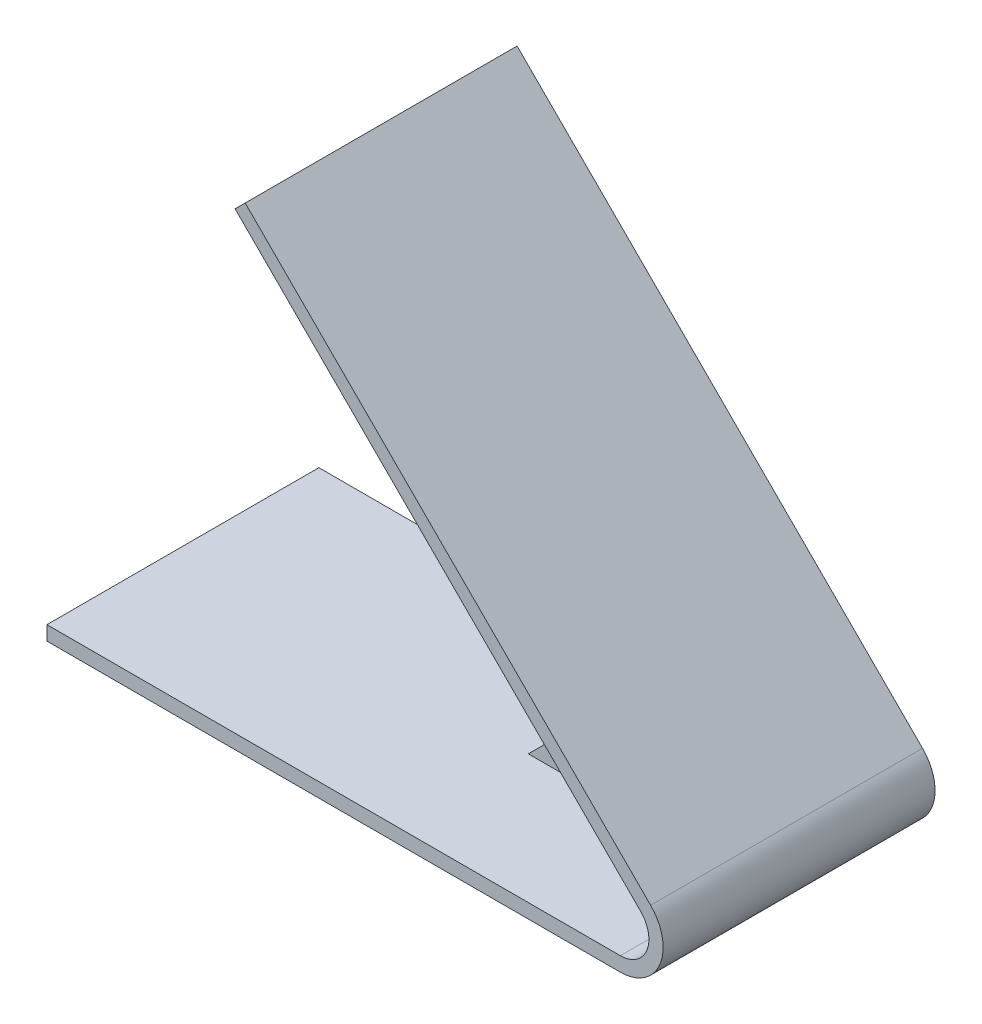
ISO-10303-21;
HEADER;
FILE_DESCRIPTION(('STEP AP214'),'2;1');
FILE_NAME('part.step','',(''),(''),'','','');
FILE_SCHEMA(('AUTOMOTIVE_DESIGN { 1 0 10303 214 1 1 1 1 }'));
ENDSEC;
DATA;
#1=APPLICATION_CONTEXT('core data for automotive mechanical design processes');
#2=APPLICATION_PROTOCOL_DEFINITION('international standard','automotive_design',2000,#1);
#3=PRODUCT_CONTEXT('',#1,'mechanical');
#4=PRODUCT('Part','Part','',(#3));
#5=PRODUCT_RELATED_PRODUCT_CATEGORY('part','',(#4));
#6=PRODUCT_DEFINITION_FORMATION('','',#4);
#7=PRODUCT_DEFINITION_CONTEXT('part definition',#1,'design');
#8=PRODUCT_DEFINITION('design','',#6,#7);
#9=PRODUCT_DEFINITION_SHAPE('','',#8);
#10=(LENGTH_UNIT() NAMED_UNIT(*) SI_UNIT(.MILLI.,.METRE.));
#11=(NAMED_UNIT(*) PLANE_ANGLE_UNIT() SI_UNIT($,.RADIAN.));
#12=(NAMED_UNIT(*) SI_UNIT($,.STERADIAN.) SOLID_ANGLE_UNIT());
#13=UNCERTAINTY_MEASURE_WITH_UNIT(LENGTH_MEASURE(1.E-05),#10,'distance_accuracy_value','');
#14=(GEOMETRIC_REPRESENTATION_CONTEXT(3) GLOBAL_UNCERTAINTY_ASSIGNED_CONTEXT((#13)) GLOBAL_UNIT_ASSIGNED_CONTEXT((#10,
#11,#12)) REPRESENTATION_CONTEXT('',''));
#15=CARTESIAN_POINT('',(0.,0.,0.));
#16=DIRECTION('',(0.,0.,1.));
#17=DIRECTION('',(1.,0.,0.));
#18=AXIS2_PLACEMENT_3D('',#15,#16,#17);
#19=CARTESIAN_POINT('',(-6.82842712474628,6.82842712474621,38.1));
#20=DIRECTION('',(0.707106781186544,0.707106781186551,0.));
#21=DIRECTION('',(-0.707106781186551,0.707106781186544,0.));
#22=AXIS2_PLACEMENT_3D('',#19,#20,#21);
#23=PLANE('',#22);
#24=DIRECTION('',(-0.707106781186564,0.707106781186531,0.));
#25=VECTOR('',#24,1.);
#26=CARTESIAN_POINT('',(-20.2988113063503,20.2988113063496,20.05));
#27=LINE('',#26,#25);
#28=CARTESIAN_POINT('',(-6.82842712474628,6.82842712474621,20.05));
#29=VERTEX_POINT('',#28);
#30=CARTESIAN_POINT('',(-20.2988113063503,20.2988113063496,20.05));
#31=VERTEX_POINT('',#30);
#32=EDGE_CURVE('E138',#29,#31,#27,.T.);
#33=ORIENTED_EDGE('',*,*,#32,.F.);
#34=DIRECTION('',(0.,0.,-1.));
#35=VECTOR('',#34,1.);
#36=CARTESIAN_POINT('',(-6.82842712474628,6.82842712474621,38.1));
#37=LINE('',#36,#35);
#38=CARTESIAN_POINT('',(-6.82842712474628,6.82842712474621,38.1));
#39=VERTEX_POINT('',#38);
#40=EDGE_CURVE('E51',#39,#29,#37,.T.);
#41=ORIENTED_EDGE('',*,*,#40,.F.);
#42=DIRECTION('',(0.707106781186551,-0.707106781186544,0.));
#43=VECTOR('',#42,1.);
#44=CARTESIAN_POINT('',(-6.82842712474628,6.82842712474621,38.1));
#45=LINE('',#44,#43);
#46=CARTESIAN_POINT('',(-63.6396103067896,63.6396103067889,38.1));
#47=VERTEX_POINT('',#46);
#48=EDGE_CURVE('E166',#47,#39,#45,.T.);
#49=ORIENTED_EDGE('',*,*,#48,.F.);
#50=DIRECTION('',(0.,0.,-1.));
#51=VECTOR('',#50,1.);
#52=CARTESIAN_POINT('',(-63.6396103067896,63.6396103067889,38.1));
#53=LINE('',#52,#51);
#54=CARTESIAN_POINT('',(-63.6396103067896,63.6396103067889,0.));
#55=VERTEX_POINT('',#54);
#56=EDGE_CURVE('E13',#47,#55,#53,.T.);
#57=ORIENTED_EDGE('',*,*,#56,.T.);
#58=DIRECTION('',(0.707106781186551,-0.707106781186544,0.));
#59=VECTOR('',#58,1.);
#60=CARTESIAN_POINT('',(-6.82842712474628,6.82842712474621,0.));
#61=LINE('',#60,#59);
#62=CARTESIAN_POINT('',(-6.82842712474628,6.82842712474621,0.));
#63=VERTEX_POINT('',#62);
#64=EDGE_CURVE('E157',#55,#63,#61,.T.);
#65=ORIENTED_EDGE('',*,*,#64,.T.);
#66=CARTESIAN_POINT('',(-6.82842712474628,6.82842712474621,18.05));
#67=VERTEX_POINT('',#66);
#68=EDGE_CURVE('E211',#67,#63,#37,.T.);
#69=ORIENTED_EDGE('',*,*,#68,.F.);
#70=DIRECTION('',(-0.707106781186564,0.707106781186531,0.));
#71=VECTOR('',#70,1.);
#72=CARTESIAN_POINT('',(-20.2988113063503,20.2988113063496,18.05));
#73=LINE('',#72,#71);
#74=CARTESIAN_POINT('',(-20.2988113063503,20.2988113063496,18.05));
#75=VERTEX_POINT('',#74);
#76=EDGE_CURVE('E58',#67,#75,#73,.T.);
#77=ORIENTED_EDGE('',*,*,#76,.T.);
#78=DIRECTION('',(0.,0.,-1.));
#79=VECTOR('',#78,1.);
#80=CARTESIAN_POINT('',(-20.2988113063503,20.2988113063496,20.05));
#81=LINE('',#80,#79);
#82=EDGE_CURVE('E159',#31,#75,#81,.T.);
#83=ORIENTED_EDGE('',*,*,#82,.F.);
#84=EDGE_LOOP('',(#33,#41,#49,#57,#65,#69,#77,#83));
#85=FACE_BOUND('',#84,.T.);
#86=ADVANCED_FACE('F43',(#85),#23,.F.);
#87=CARTESIAN_POINT('',(-9.65685424949246,0.,38.1));
#88=DIRECTION('',(0.,-1.,0.));
#89=DIRECTION('',(1.,0.,0.));
#90=AXIS2_PLACEMENT_3D('',#87,#88,#89);
#91=PLANE('',#90);
#92=DIRECTION('',(-1.,0.,0.));
#93=VECTOR('',#92,1.);
#94=CARTESIAN_POINT('',(-9.65685424949246,0.,0.));
#95=LINE('',#94,#93);
#96=CARTESIAN_POINT('',(-9.65685424949245,0.,0.));
#97=VERTEX_POINT('',#96);
#98=CARTESIAN_POINT('',(-90.,0.,0.));
#99=VERTEX_POINT('',#98);
#100=EDGE_CURVE('E186',#97,#99,#95,.T.);
#101=ORIENTED_EDGE('',*,*,#100,.T.);
#102=DIRECTION('',(0.,0.,-1.));
#103=VECTOR('',#102,1.);
#104=CARTESIAN_POINT('',(-90.,0.,38.1));
#105=LINE('',#104,#103);
#106=CARTESIAN_POINT('',(-90.,0.,38.1));
#107=VERTEX_POINT('',#106);
#108=EDGE_CURVE('E206',#107,#99,#105,.T.);
#109=ORIENTED_EDGE('',*,*,#108,.F.);
#110=DIRECTION('',(-1.,0.,0.));
#111=VECTOR('',#110,1.);
#112=CARTESIAN_POINT('',(-9.65685424949246,0.,38.1));
#113=LINE('',#112,#111);
#114=CARTESIAN_POINT('',(-9.65685424949245,0.,38.1));
#115=VERTEX_POINT('',#114);
#116=EDGE_CURVE('E171',#115,#107,#113,.T.);
#117=ORIENTED_EDGE('',*,*,#116,.F.);
#118=DIRECTION('',(0.,0.,-1.));
#119=VECTOR('',#118,1.);
#120=CARTESIAN_POINT('',(-9.65685424949245,0.,38.1));
#121=LINE('',#120,#119);
#122=EDGE_CURVE('E209',#115,#97,#121,.T.);
#123=ORIENTED_EDGE('',*,*,#122,.T.);
#124=EDGE_LOOP('',(#101,#109,#117,#123));
#125=FACE_BOUND('',#124,.T.);
#126=DIRECTION('',(1.,0.,0.));
#127=VECTOR('',#126,1.);
#128=CARTESIAN_POINT('',(-13.6568542494925,0.,20.05));
#129=LINE('',#128,#127);
#130=CARTESIAN_POINT('',(-40.5976226127,0.,20.05));
#131=VERTEX_POINT('',#130);
#132=CARTESIAN_POINT('',(-13.6568542494925,0.,20.05));
#133=VERTEX_POINT('',#132);
#134=EDGE_CURVE('E139',#131,#133,#129,.T.);
#135=ORIENTED_EDGE('',*,*,#134,.F.);
#136=DIRECTION('',(0.,0.,-1.));
#137=VECTOR('',#136,1.);
#138=CARTESIAN_POINT('',(-40.5976226127,0.,20.05));
#139=LINE('',#138,#137);
#140=CARTESIAN_POINT('',(-40.5976226127,0.,18.05));
#141=VERTEX_POINT('',#140);
#142=EDGE_CURVE('E242',#131,#141,#139,.T.);
#143=ORIENTED_EDGE('',*,*,#142,.T.);
#144=DIRECTION('',(1.,0.,0.));
#145=VECTOR('',#144,1.);
#146=CARTESIAN_POINT('',(-13.6568542494925,0.,18.05));
#147=LINE('',#146,#145);
#148=CARTESIAN_POINT('',(-13.6568542494925,0.,18.05));
#149=VERTEX_POINT('',#148);
#150=EDGE_CURVE('E153',#141,#149,#147,.T.);
#151=ORIENTED_EDGE('',*,*,#150,.T.);
#152=DIRECTION('',(0.,0.,-1.));
#153=VECTOR('',#152,1.);
#154=CARTESIAN_POINT('',(-13.6568542494925,0.,20.05));
#155=LINE('',#154,#153);
#156=EDGE_CURVE('E65',#133,#149,#155,.T.);
#157=ORIENTED_EDGE('',*,*,#156,.F.);
#158=EDGE_LOOP('',(#135,#143,#151,#157));
#159=FACE_BOUND('',#158,.T.);
#160=ADVANCED_FACE('F151',(#125,#159),#91,.F.);
#161=CARTESIAN_POINT('',(-62.2253967444165,65.053823869162,38.1));
#162=DIRECTION('',(0.707106781186554,-0.707106781186541,0.));
#163=DIRECTION('',(0.707106781186541,0.707106781186554,0.));
#164=AXIS2_PLACEMENT_3D('',#161,#162,#163);
#165=PLANE('',#164);
#166=DIRECTION('',(-0.707106781186541,-0.707106781186554,0.));
#167=VECTOR('',#166,1.);
#168=CARTESIAN_POINT('',(-62.2253967444165,65.053823869162,0.));
#169=LINE('',#168,#167);
#170=CARTESIAN_POINT('',(-62.2253967444165,65.053823869162,0.));
#171=VERTEX_POINT('',#170);
#172=EDGE_CURVE('E154',#171,#55,#169,.T.);
#173=ORIENTED_EDGE('',*,*,#172,.T.);
#174=ORIENTED_EDGE('',*,*,#56,.F.);
#175=DIRECTION('',(-0.707106781186541,-0.707106781186554,0.));
#176=VECTOR('',#175,1.);
#177=CARTESIAN_POINT('',(-62.2253967444165,65.053823869162,38.1));
#178=LINE('',#177,#176);
#179=CARTESIAN_POINT('',(-62.2253967444165,65.053823869162,38.1));
#180=VERTEX_POINT('',#179);
#181=EDGE_CURVE('E163',#180,#47,#178,.T.);
#182=ORIENTED_EDGE('',*,*,#181,.F.);
#183=DIRECTION('',(0.,0.,-1.));
#184=VECTOR('',#183,1.);
#185=CARTESIAN_POINT('',(-62.2253967444165,65.053823869162,38.1));
#186=LINE('',#185,#184);
#187=EDGE_CURVE('E180',#180,#171,#186,.T.);
#188=ORIENTED_EDGE('',*,*,#187,.T.);
#189=EDGE_LOOP('',(#173,#174,#182,#188));
#190=FACE_BOUND('',#189,.T.);
#191=ADVANCED_FACE('F45',(#190),#165,.F.);
#192=CARTESIAN_POINT('',(-9.65685424949245,4.,38.1));
#193=DIRECTION('',(0.,0.,-1.));
#194=DIRECTION('',(-1.,0.,0.));
#195=AXIS2_PLACEMENT_3D('',#192,#193,#194);
#196=CYLINDRICAL_SURFACE('',#195,4.);
#197=CARTESIAN_POINT('',(-9.65685424949245,4.,0.));
#198=DIRECTION('',(0.,0.,-1.));
#199=DIRECTION('',(-1.,0.,0.));
#200=AXIS2_PLACEMENT_3D('',#197,#198,#199);
#201=CIRCLE('',#200,4.);
#202=EDGE_CURVE('E184',#63,#97,#201,.T.);
#203=ORIENTED_EDGE('',*,*,#202,.T.);
#204=ORIENTED_EDGE('',*,*,#122,.F.);
#205=CARTESIAN_POINT('',(-9.65685424949245,4.,38.1));
#206=DIRECTION('',(0.,0.,-1.));
#207=DIRECTION('',(-1.,0.,0.));
#208=AXIS2_PLACEMENT_3D('',#205,#206,#207);
#209=CIRCLE('',#208,4.);
#210=EDGE_CURVE('E169',#39,#115,#209,.T.);
#211=ORIENTED_EDGE('',*,*,#210,.F.);
#212=ORIENTED_EDGE('',*,*,#40,.T.);
#213=DIRECTION('',(0.,0.,-1.));
#214=VECTOR('',#213,1.);
#215=CARTESIAN_POINT('',(-6.82842712474628,6.82842712474621,20.05));
#216=LINE('',#215,#214);
#217=EDGE_CURVE('E135',#29,#67,#216,.T.);
#218=ORIENTED_EDGE('',*,*,#217,.T.);
#219=ORIENTED_EDGE('',*,*,#68,.T.);
#220=EDGE_LOOP('',(#203,#204,#211,#212,#218,#219));
#221=FACE_BOUND('',#220,.T.);
#222=ADVANCED_FACE('F217',(#221),#196,.F.);
#223=CARTESIAN_POINT('',(-90.,-2.,38.1));
#224=DIRECTION('',(1.,0.,0.));
#225=DIRECTION('',(0.,0.,-1.));
#226=AXIS2_PLACEMENT_3D('',#223,#224,#225);
#227=PLANE('',#226);
#228=DIRECTION('',(0.,-1.,0.));
#229=VECTOR('',#228,1.);
#230=CARTESIAN_POINT('',(-90.,-2.,0.));
#231=LINE('',#230,#229);
#232=CARTESIAN_POINT('',(-90.,-2.,0.));
#233=VERTEX_POINT('',#232);
#234=EDGE_CURVE('E188',#99,#233,#231,.T.);
#235=ORIENTED_EDGE('',*,*,#234,.T.);
#236=DIRECTION('',(0.,0.,-1.));
#237=VECTOR('',#236,1.);
#238=CARTESIAN_POINT('',(-90.,-2.,38.1));
#239=LINE('',#238,#237);
#240=CARTESIAN_POINT('',(-90.,-2.,38.1));
#241=VERTEX_POINT('',#240);
#242=EDGE_CURVE('E203',#241,#233,#239,.T.);
#243=ORIENTED_EDGE('',*,*,#242,.F.);
#244=DIRECTION('',(0.,-1.,0.));
#245=VECTOR('',#244,1.);
#246=CARTESIAN_POINT('',(-90.,-2.,38.1));
#247=LINE('',#246,#245);
#248=EDGE_CURVE('E173',#107,#241,#247,.T.);
#249=ORIENTED_EDGE('',*,*,#248,.F.);
#250=ORIENTED_EDGE('',*,*,#108,.T.);
#251=EDGE_LOOP('',(#235,#243,#249,#250));
#252=FACE_BOUND('',#251,.T.);
#253=ADVANCED_FACE('F233',(#252),#227,.F.);
#254=CARTESIAN_POINT('',(-9.65685424949246,-2.,38.1));
#255=DIRECTION('',(0.,1.,0.));
#256=DIRECTION('',(0.,0.,1.));
#257=AXIS2_PLACEMENT_3D('',#254,#255,#256);
#258=PLANE('',#257);
#259=DIRECTION('',(1.,0.,0.));
#260=VECTOR('',#259,1.);
#261=CARTESIAN_POINT('',(-9.65685424949246,-2.,0.));
#262=LINE('',#261,#260);
#263=CARTESIAN_POINT('',(-9.65685424949246,-2.,0.));
#264=VERTEX_POINT('',#263);
#265=EDGE_CURVE('E190',#233,#264,#262,.T.);
#266=ORIENTED_EDGE('',*,*,#265,.T.);
#267=DIRECTION('',(0.,0.,-1.));
#268=VECTOR('',#267,1.);
#269=CARTESIAN_POINT('',(-9.65685424949246,-2.,38.1));
#270=LINE('',#269,#268);
#271=CARTESIAN_POINT('',(-9.65685424949246,-2.,38.1));
#272=VERTEX_POINT('',#271);
#273=EDGE_CURVE('E200',#272,#264,#270,.T.);
#274=ORIENTED_EDGE('',*,*,#273,.F.);
#275=DIRECTION('',(1.,0.,0.));
#276=VECTOR('',#275,1.);
#277=CARTESIAN_POINT('',(-9.65685424949246,-2.,38.1));
#278=LINE('',#277,#276);
#279=EDGE_CURVE('E175',#241,#272,#278,.T.);
#280=ORIENTED_EDGE('',*,*,#279,.F.);
#281=ORIENTED_EDGE('',*,*,#242,.T.);
#282=EDGE_LOOP('',(#266,#274,#280,#281));
#283=FACE_BOUND('',#282,.T.);
#284=ADVANCED_FACE('F270',(#283),#258,.F.);
#285=CARTESIAN_POINT('',(-9.65685424949246,4.,38.1));
#286=DIRECTION('',(0.,0.,-1.));
#287=DIRECTION('',(-1.,0.,0.));
#288=AXIS2_PLACEMENT_3D('',#285,#286,#287);
#289=CYLINDRICAL_SURFACE('',#288,6.);
#290=CARTESIAN_POINT('',(-9.65685424949246,4.,0.));
#291=DIRECTION('',(0.,0.,1.));
#292=DIRECTION('',(-1.,0.,0.));
#293=AXIS2_PLACEMENT_3D('',#290,#291,#292);
#294=CIRCLE('',#293,6.);
#295=CARTESIAN_POINT('',(-5.41421356237319,8.24264068711931,0.));
#296=VERTEX_POINT('',#295);
#297=EDGE_CURVE('E192',#264,#296,#294,.T.);
#298=ORIENTED_EDGE('',*,*,#297,.T.);
#299=DIRECTION('',(0.,0.,-1.));
#300=VECTOR('',#299,1.);
#301=CARTESIAN_POINT('',(-5.41421356237319,8.24264068711931,38.1));
#302=LINE('',#301,#300);
#303=CARTESIAN_POINT('',(-5.41421356237319,8.24264068711931,38.1));
#304=VERTEX_POINT('',#303);
#305=EDGE_CURVE('E197',#304,#296,#302,.T.);
#306=ORIENTED_EDGE('',*,*,#305,.F.);
#307=CARTESIAN_POINT('',(-9.65685424949246,4.,38.1));
#308=DIRECTION('',(0.,0.,1.));
#309=DIRECTION('',(-1.,0.,0.));
#310=AXIS2_PLACEMENT_3D('',#307,#308,#309);
#311=CIRCLE('',#310,6.);
#312=EDGE_CURVE('E177',#272,#304,#311,.T.);
#313=ORIENTED_EDGE('',*,*,#312,.F.);
#314=ORIENTED_EDGE('',*,*,#273,.T.);
#315=EDGE_LOOP('',(#298,#306,#313,#314));
#316=FACE_BOUND('',#315,.T.);
#317=ADVANCED_FACE('F273',(#316),#289,.T.);
#318=CARTESIAN_POINT('',(-5.41421356237319,8.24264068711931,38.1));
#319=DIRECTION('',(-0.707106781186544,-0.707106781186551,0.));
#320=DIRECTION('',(0.707106781186551,-0.707106781186544,0.));
#321=AXIS2_PLACEMENT_3D('',#318,#319,#320);
#322=PLANE('',#321);
#323=DIRECTION('',(-0.707106781186551,0.707106781186544,0.));
#324=VECTOR('',#323,1.);
#325=CARTESIAN_POINT('',(-5.41421356237319,8.24264068711931,0.));
#326=LINE('',#325,#324);
#327=EDGE_CURVE('E167',#296,#171,#326,.T.);
#328=ORIENTED_EDGE('',*,*,#327,.T.);
#329=ORIENTED_EDGE('',*,*,#187,.F.);
#330=DIRECTION('',(-0.707106781186551,0.707106781186544,0.));
#331=VECTOR('',#330,1.);
#332=CARTESIAN_POINT('',(-5.41421356237319,8.24264068711931,38.1));
#333=LINE('',#332,#331);
#334=EDGE_CURVE('E179',#304,#180,#333,.T.);
#335=ORIENTED_EDGE('',*,*,#334,.F.);
#336=ORIENTED_EDGE('',*,*,#305,.T.);
#337=EDGE_LOOP('',(#328,#329,#335,#336));
#338=FACE_BOUND('',#337,.T.);
#339=ADVANCED_FACE('F277',(#338),#322,.F.);
#340=CARTESIAN_POINT('',(-9.65685424949245,4.,38.1));
#341=DIRECTION('',(0.,0.,-1.));
#342=DIRECTION('',(-1.,0.,0.));
#343=AXIS2_PLACEMENT_3D('',#340,#341,#342);
#344=PLANE('',#343);
#345=ORIENTED_EDGE('',*,*,#181,.T.);
#346=ORIENTED_EDGE('',*,*,#48,.T.);
#347=ORIENTED_EDGE('',*,*,#210,.T.);
#348=ORIENTED_EDGE('',*,*,#116,.T.);
#349=ORIENTED_EDGE('',*,*,#248,.T.);
#350=ORIENTED_EDGE('',*,*,#279,.T.);
#351=ORIENTED_EDGE('',*,*,#312,.T.);
#352=ORIENTED_EDGE('',*,*,#334,.T.);
#353=EDGE_LOOP('',(#345,#346,#347,#348,#349,#350,#351,#352));
#354=FACE_BOUND('',#353,.T.);
#355=ADVANCED_FACE('F237',(#354),#344,.F.);
#356=CARTESIAN_POINT('',(-9.65685424949245,4.,0.));
#357=DIRECTION('',(0.,0.,-1.));
#358=DIRECTION('',(-1.,0.,0.));
#359=AXIS2_PLACEMENT_3D('',#356,#357,#358);
#360=PLANE('',#359);
#361=ORIENTED_EDGE('',*,*,#172,.F.);
#362=ORIENTED_EDGE('',*,*,#327,.F.);
#363=ORIENTED_EDGE('',*,*,#297,.F.);
#364=ORIENTED_EDGE('',*,*,#265,.F.);
#365=ORIENTED_EDGE('',*,*,#234,.F.);
#366=ORIENTED_EDGE('',*,*,#100,.F.);
#367=ORIENTED_EDGE('',*,*,#202,.F.);
#368=ORIENTED_EDGE('',*,*,#64,.F.);
#369=EDGE_LOOP('',(#361,#362,#363,#364,#365,#366,#367,#368));
#370=FACE_BOUND('',#369,.T.);
#371=ADVANCED_FACE('F225',(#370),#360,.T.);
#372=CARTESIAN_POINT('',(-6.82842712474628,6.82842712474621,20.05));
#373=DIRECTION('',(-0.707106781186548,0.707106781186547,0.));
#374=DIRECTION('',(-0.707106781186547,-0.707106781186548,0.));
#375=AXIS2_PLACEMENT_3D('',#372,#373,#374);
#376=PLANE('',#375);
#377=DIRECTION('',(0.707106781186547,0.707106781186548,0.));
#378=VECTOR('',#377,1.);
#379=CARTESIAN_POINT('',(-6.82842712474628,6.82842712474621,18.05));
#380=LINE('',#379,#378);
#381=EDGE_CURVE('E246',#149,#67,#380,.T.);
#382=ORIENTED_EDGE('',*,*,#381,.T.);
#383=ORIENTED_EDGE('',*,*,#217,.F.);
#384=DIRECTION('',(0.707106781186547,0.707106781186548,0.));
#385=VECTOR('',#384,1.);
#386=CARTESIAN_POINT('',(-6.82842712474628,6.82842712474621,20.05));
#387=LINE('',#386,#385);
#388=EDGE_CURVE('E131',#133,#29,#387,.T.);
#389=ORIENTED_EDGE('',*,*,#388,.F.);
#390=ORIENTED_EDGE('',*,*,#156,.T.);
#391=EDGE_LOOP('',(#382,#383,#389,#390));
#392=FACE_BOUND('',#391,.T.);
#393=ADVANCED_FACE('F133',(#392),#376,.F.);
#394=CARTESIAN_POINT('',(-40.5976226127,0.,20.05));
#395=DIRECTION('',(0.707106781186548,-0.707106781186547,0.));
#396=DIRECTION('',(0.707106781186547,0.707106781186548,0.));
#397=AXIS2_PLACEMENT_3D('',#394,#395,#396);
#398=PLANE('',#397);
#399=DIRECTION('',(-0.707106781186547,-0.707106781186548,0.));
#400=VECTOR('',#399,1.);
#401=CARTESIAN_POINT('',(-40.5976226127,0.,18.05));
#402=LINE('',#401,#400);
#403=EDGE_CURVE('E148',#75,#141,#402,.T.);
#404=ORIENTED_EDGE('',*,*,#403,.T.);
#405=ORIENTED_EDGE('',*,*,#142,.F.);
#406=DIRECTION('',(-0.707106781186547,-0.707106781186548,0.));
#407=VECTOR('',#406,1.);
#408=CARTESIAN_POINT('',(-40.5976226127,0.,20.05));
#409=LINE('',#408,#407);
#410=EDGE_CURVE('E144',#31,#131,#409,.T.);
#411=ORIENTED_EDGE('',*,*,#410,.F.);
#412=ORIENTED_EDGE('',*,*,#82,.T.);
#413=EDGE_LOOP('',(#404,#405,#411,#412));
#414=FACE_BOUND('',#413,.T.);
#415=ADVANCED_FACE('F251',(#414),#398,.F.);
#416=CARTESIAN_POINT('',(0.,0.,20.05));
#417=DIRECTION('',(0.,0.,-1.));
#418=DIRECTION('',(-1.,0.,0.));
#419=AXIS2_PLACEMENT_3D('',#416,#417,#418);
#420=PLANE('',#419);
#421=ORIENTED_EDGE('',*,*,#134,.T.);
#422=ORIENTED_EDGE('',*,*,#388,.T.);
#423=ORIENTED_EDGE('',*,*,#32,.T.);
#424=ORIENTED_EDGE('',*,*,#410,.T.);
#425=EDGE_LOOP('',(#421,#422,#423,#424));
#426=FACE_BOUND('',#425,.T.);
#427=ADVANCED_FACE('F142',(#426),#420,.F.);
#428=CARTESIAN_POINT('',(0.,0.,18.05));
#429=DIRECTION('',(0.,0.,-1.));
#430=DIRECTION('',(-1.,0.,0.));
#431=AXIS2_PLACEMENT_3D('',#428,#429,#430);
#432=PLANE('',#431);
#433=ORIENTED_EDGE('',*,*,#150,.F.);
#434=ORIENTED_EDGE('',*,*,#403,.F.);
#435=ORIENTED_EDGE('',*,*,#76,.F.);
#436=ORIENTED_EDGE('',*,*,#381,.F.);
#437=EDGE_LOOP('',(#433,#434,#435,#436));
#438=FACE_BOUND('',#437,.T.);
#439=ADVANCED_FACE('F252',(#438),#432,.T.);
#440=CLOSED_SHELL('',(#86,#160,#191,#222,#253,#284,#317,#339,#355,#371,#393,#415,#427,#439));
#441=MANIFOLD_SOLID_BREP('B2',#440);
#442=ADVANCED_BREP_SHAPE_REPRESENTATION('',(#18,#441),#14);
#443=SHAPE_DEFINITION_REPRESENTATION(#9,#442);
ENDSEC;
END-ISO-10303-21;
